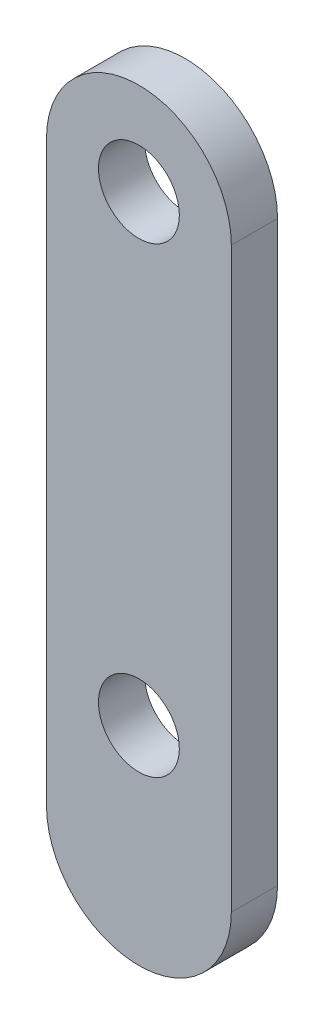
ISO-10303-21;
HEADER;
FILE_DESCRIPTION(('STEP AP214'),'2;1');
FILE_NAME('part.step','',(''),(''),'','','');
FILE_SCHEMA(('AUTOMOTIVE_DESIGN { 1 0 10303 214 1 1 1 1 }'));
ENDSEC;
DATA;
#1=APPLICATION_CONTEXT('core data for automotive mechanical design processes');
#2=APPLICATION_PROTOCOL_DEFINITION('international standard','automotive_design',2000,#1);
#3=PRODUCT_CONTEXT('',#1,'mechanical');
#4=PRODUCT('Part','Part','',(#3));
#5=PRODUCT_RELATED_PRODUCT_CATEGORY('part','',(#4));
#6=PRODUCT_DEFINITION_FORMATION('','',#4);
#7=PRODUCT_DEFINITION_CONTEXT('part definition',#1,'design');
#8=PRODUCT_DEFINITION('design','',#6,#7);
#9=PRODUCT_DEFINITION_SHAPE('','',#8);
#10=(LENGTH_UNIT() NAMED_UNIT(*) SI_UNIT(.MILLI.,.METRE.));
#11=(NAMED_UNIT(*) PLANE_ANGLE_UNIT() SI_UNIT($,.RADIAN.));
#12=(NAMED_UNIT(*) SI_UNIT($,.STERADIAN.) SOLID_ANGLE_UNIT());
#13=UNCERTAINTY_MEASURE_WITH_UNIT(LENGTH_MEASURE(1.E-05),#10,'distance_accuracy_value','');
#14=(GEOMETRIC_REPRESENTATION_CONTEXT(3) GLOBAL_UNCERTAINTY_ASSIGNED_CONTEXT((#13)) GLOBAL_UNIT_ASSIGNED_CONTEXT((#10,
#11,#12)) REPRESENTATION_CONTEXT('',''));
#15=CARTESIAN_POINT('',(0.,0.,0.));
#16=DIRECTION('',(0.,0.,1.));
#17=DIRECTION('',(1.,0.,0.));
#18=AXIS2_PLACEMENT_3D('',#15,#16,#17);
#19=CARTESIAN_POINT('',(0.,0.,2.));
#20=DIRECTION('',(0.,0.,1.));
#21=DIRECTION('',(1.,0.,0.));
#22=AXIS2_PLACEMENT_3D('',#19,#20,#21);
#23=PLANE('',#22);
#24=CARTESIAN_POINT('',(0.,5.,2.));
#25=DIRECTION('',(0.,0.,1.));
#26=DIRECTION('',(1.,0.,0.));
#27=AXIS2_PLACEMENT_3D('',#24,#25,#26);
#28=CIRCLE('',#27,1.75);
#29=CARTESIAN_POINT('',(1.75,5.,2.));
#30=VERTEX_POINT('',#29);
#31=EDGE_CURVE('E106',#30,#30,#28,.T.);
#32=ORIENTED_EDGE('',*,*,#31,.F.);
#33=EDGE_LOOP('',(#32));
#34=FACE_BOUND('',#33,.T.);
#35=CARTESIAN_POINT('',(0.,0.,2.));
#36=DIRECTION('',(0.,0.,1.));
#37=DIRECTION('',(1.,0.,0.));
#38=AXIS2_PLACEMENT_3D('',#35,#36,#37);
#39=CIRCLE('',#38,4.);
#40=CARTESIAN_POINT('',(-4.,0.,2.));
#41=VERTEX_POINT('',#40);
#42=CARTESIAN_POINT('',(4.,0.,2.));
#43=VERTEX_POINT('',#42);
#44=EDGE_CURVE('E91',#41,#43,#39,.T.);
#45=ORIENTED_EDGE('',*,*,#44,.T.);
#46=DIRECTION('',(0.,1.,0.));
#47=VECTOR('',#46,1.);
#48=CARTESIAN_POINT('',(4.,0.,2.));
#49=LINE('',#48,#47);
#50=CARTESIAN_POINT('',(4.,25.,2.));
#51=VERTEX_POINT('',#50);
#52=EDGE_CURVE('E86',#43,#51,#49,.T.);
#53=ORIENTED_EDGE('',*,*,#52,.T.);
#54=CARTESIAN_POINT('',(0.,25.,2.));
#55=DIRECTION('',(0.,0.,1.));
#56=DIRECTION('',(1.,0.,0.));
#57=AXIS2_PLACEMENT_3D('',#54,#55,#56);
#58=CIRCLE('',#57,4.);
#59=CARTESIAN_POINT('',(-4.,25.,2.));
#60=VERTEX_POINT('',#59);
#61=EDGE_CURVE('E89',#51,#60,#58,.T.);
#62=ORIENTED_EDGE('',*,*,#61,.T.);
#63=DIRECTION('',(0.,-1.,0.));
#64=VECTOR('',#63,1.);
#65=CARTESIAN_POINT('',(-4.,0.,2.));
#66=LINE('',#65,#64);
#67=EDGE_CURVE('E56',#60,#41,#66,.T.);
#68=ORIENTED_EDGE('',*,*,#67,.T.);
#69=EDGE_LOOP('',(#45,#53,#62,#68));
#70=FACE_BOUND('',#69,.T.);
#71=CARTESIAN_POINT('',(0.,25.,2.));
#72=DIRECTION('',(0.,0.,1.));
#73=DIRECTION('',(1.,0.,0.));
#74=AXIS2_PLACEMENT_3D('',#71,#72,#73);
#75=CIRCLE('',#74,1.75);
#76=CARTESIAN_POINT('',(1.75,25.,2.));
#77=VERTEX_POINT('',#76);
#78=EDGE_CURVE('E121',#77,#77,#75,.T.);
#79=ORIENTED_EDGE('',*,*,#78,.F.);
#80=EDGE_LOOP('',(#79));
#81=FACE_BOUND('',#80,.T.);
#82=ADVANCED_FACE('F39',(#34,#70,#81),#23,.T.);
#83=CARTESIAN_POINT('',(0.,0.,0.));
#84=DIRECTION('',(0.,0.,1.));
#85=DIRECTION('',(1.,0.,0.));
#86=AXIS2_PLACEMENT_3D('',#83,#84,#85);
#87=PLANE('',#86);
#88=CARTESIAN_POINT('',(0.,0.,0.));
#89=DIRECTION('',(0.,0.,1.));
#90=DIRECTION('',(1.,0.,0.));
#91=AXIS2_PLACEMENT_3D('',#88,#89,#90);
#92=CIRCLE('',#91,4.);
#93=CARTESIAN_POINT('',(-4.,0.,0.));
#94=VERTEX_POINT('',#93);
#95=CARTESIAN_POINT('',(4.,0.,0.));
#96=VERTEX_POINT('',#95);
#97=EDGE_CURVE('E103',#94,#96,#92,.T.);
#98=ORIENTED_EDGE('',*,*,#97,.F.);
#99=DIRECTION('',(0.,-1.,0.));
#100=VECTOR('',#99,1.);
#101=CARTESIAN_POINT('',(-4.,0.,0.));
#102=LINE('',#101,#100);
#103=CARTESIAN_POINT('',(-4.,25.,0.));
#104=VERTEX_POINT('',#103);
#105=EDGE_CURVE('E79',#104,#94,#102,.T.);
#106=ORIENTED_EDGE('',*,*,#105,.F.);
#107=CARTESIAN_POINT('',(0.,25.,0.));
#108=DIRECTION('',(0.,0.,1.));
#109=DIRECTION('',(1.,0.,0.));
#110=AXIS2_PLACEMENT_3D('',#107,#108,#109);
#111=CIRCLE('',#110,4.);
#112=CARTESIAN_POINT('',(4.,25.,0.));
#113=VERTEX_POINT('',#112);
#114=EDGE_CURVE('E73',#113,#104,#111,.T.);
#115=ORIENTED_EDGE('',*,*,#114,.F.);
#116=DIRECTION('',(0.,1.,0.));
#117=VECTOR('',#116,1.);
#118=CARTESIAN_POINT('',(4.,0.,0.));
#119=LINE('',#118,#117);
#120=EDGE_CURVE('E95',#96,#113,#119,.T.);
#121=ORIENTED_EDGE('',*,*,#120,.F.);
#122=EDGE_LOOP('',(#98,#106,#115,#121));
#123=FACE_BOUND('',#122,.T.);
#124=CARTESIAN_POINT('',(0.,5.,0.));
#125=DIRECTION('',(0.,0.,1.));
#126=DIRECTION('',(1.,0.,0.));
#127=AXIS2_PLACEMENT_3D('',#124,#125,#126);
#128=CIRCLE('',#127,1.75);
#129=CARTESIAN_POINT('',(1.75,5.,0.));
#130=VERTEX_POINT('',#129);
#131=EDGE_CURVE('E118',#130,#130,#128,.T.);
#132=ORIENTED_EDGE('',*,*,#131,.T.);
#133=EDGE_LOOP('',(#132));
#134=FACE_BOUND('',#133,.T.);
#135=CARTESIAN_POINT('',(0.,25.,0.));
#136=DIRECTION('',(0.,0.,1.));
#137=DIRECTION('',(1.,0.,0.));
#138=AXIS2_PLACEMENT_3D('',#135,#136,#137);
#139=CIRCLE('',#138,1.75);
#140=CARTESIAN_POINT('',(1.75,25.,0.));
#141=VERTEX_POINT('',#140);
#142=EDGE_CURVE('E124',#141,#141,#139,.T.);
#143=ORIENTED_EDGE('',*,*,#142,.T.);
#144=EDGE_LOOP('',(#143));
#145=FACE_BOUND('',#144,.T.);
#146=ADVANCED_FACE('F114',(#123,#134,#145),#87,.F.);
#147=CARTESIAN_POINT('',(0.,0.,2.));
#148=DIRECTION('',(0.,0.,-1.));
#149=DIRECTION('',(-1.,0.,0.));
#150=AXIS2_PLACEMENT_3D('',#147,#148,#149);
#151=CYLINDRICAL_SURFACE('',#150,4.);
#152=ORIENTED_EDGE('',*,*,#97,.T.);
#153=DIRECTION('',(0.,0.,-1.));
#154=VECTOR('',#153,1.);
#155=CARTESIAN_POINT('',(4.,0.,2.));
#156=LINE('',#155,#154);
#157=EDGE_CURVE('E11',#43,#96,#156,.T.);
#158=ORIENTED_EDGE('',*,*,#157,.F.);
#159=ORIENTED_EDGE('',*,*,#44,.F.);
#160=DIRECTION('',(0.,0.,-1.));
#161=VECTOR('',#160,1.);
#162=CARTESIAN_POINT('',(-4.,0.,2.));
#163=LINE('',#162,#161);
#164=EDGE_CURVE('E99',#41,#94,#163,.T.);
#165=ORIENTED_EDGE('',*,*,#164,.T.);
#166=EDGE_LOOP('',(#152,#158,#159,#165));
#167=FACE_BOUND('',#166,.T.);
#168=ADVANCED_FACE('F41',(#167),#151,.T.);
#169=CARTESIAN_POINT('',(4.,0.,2.));
#170=DIRECTION('',(-1.,0.,0.));
#171=DIRECTION('',(0.,0.,1.));
#172=AXIS2_PLACEMENT_3D('',#169,#170,#171);
#173=PLANE('',#172);
#174=ORIENTED_EDGE('',*,*,#120,.T.);
#175=DIRECTION('',(0.,0.,-1.));
#176=VECTOR('',#175,1.);
#177=CARTESIAN_POINT('',(4.,25.,2.));
#178=LINE('',#177,#176);
#179=EDGE_CURVE('E48',#51,#113,#178,.T.);
#180=ORIENTED_EDGE('',*,*,#179,.F.);
#181=ORIENTED_EDGE('',*,*,#52,.F.);
#182=ORIENTED_EDGE('',*,*,#157,.T.);
#183=EDGE_LOOP('',(#174,#180,#181,#182));
#184=FACE_BOUND('',#183,.T.);
#185=ADVANCED_FACE('F94',(#184),#173,.F.);
#186=CARTESIAN_POINT('',(0.,25.,2.));
#187=DIRECTION('',(0.,0.,-1.));
#188=DIRECTION('',(-1.,0.,0.));
#189=AXIS2_PLACEMENT_3D('',#186,#187,#188);
#190=CYLINDRICAL_SURFACE('',#189,4.);
#191=ORIENTED_EDGE('',*,*,#114,.T.);
#192=DIRECTION('',(0.,0.,-1.));
#193=VECTOR('',#192,1.);
#194=CARTESIAN_POINT('',(-4.,25.,2.));
#195=LINE('',#194,#193);
#196=EDGE_CURVE('E96',#60,#104,#195,.T.);
#197=ORIENTED_EDGE('',*,*,#196,.F.);
#198=ORIENTED_EDGE('',*,*,#61,.F.);
#199=ORIENTED_EDGE('',*,*,#179,.T.);
#200=EDGE_LOOP('',(#191,#197,#198,#199));
#201=FACE_BOUND('',#200,.T.);
#202=ADVANCED_FACE('F97',(#201),#190,.T.);
#203=CARTESIAN_POINT('',(-4.,0.,2.));
#204=DIRECTION('',(1.,0.,0.));
#205=DIRECTION('',(0.,0.,-1.));
#206=AXIS2_PLACEMENT_3D('',#203,#204,#205);
#207=PLANE('',#206);
#208=ORIENTED_EDGE('',*,*,#105,.T.);
#209=ORIENTED_EDGE('',*,*,#164,.F.);
#210=ORIENTED_EDGE('',*,*,#67,.F.);
#211=ORIENTED_EDGE('',*,*,#196,.T.);
#212=EDGE_LOOP('',(#208,#209,#210,#211));
#213=FACE_BOUND('',#212,.T.);
#214=ADVANCED_FACE('F111',(#213),#207,.F.);
#215=CARTESIAN_POINT('',(0.,5.,2.));
#216=DIRECTION('',(0.,0.,-1.));
#217=DIRECTION('',(-1.,0.,0.));
#218=AXIS2_PLACEMENT_3D('',#215,#216,#217);
#219=CYLINDRICAL_SURFACE('',#218,1.75);
#220=ORIENTED_EDGE('',*,*,#31,.T.);
#221=EDGE_LOOP('',(#220));
#222=FACE_BOUND('',#221,.T.);
#223=ORIENTED_EDGE('',*,*,#131,.F.);
#224=EDGE_LOOP('',(#223));
#225=FACE_BOUND('',#224,.T.);
#226=ADVANCED_FACE('F141',(#222,#225),#219,.F.);
#227=CARTESIAN_POINT('',(0.,25.,2.));
#228=DIRECTION('',(0.,0.,-1.));
#229=DIRECTION('',(-1.,0.,0.));
#230=AXIS2_PLACEMENT_3D('',#227,#228,#229);
#231=CYLINDRICAL_SURFACE('',#230,1.75);
#232=ORIENTED_EDGE('',*,*,#78,.T.);
#233=EDGE_LOOP('',(#232));
#234=FACE_BOUND('',#233,.T.);
#235=ORIENTED_EDGE('',*,*,#142,.F.);
#236=EDGE_LOOP('',(#235));
#237=FACE_BOUND('',#236,.T.);
#238=ADVANCED_FACE('F130',(#234,#237),#231,.F.);
#239=CLOSED_SHELL('',(#82,#146,#168,#185,#202,#214,#226,#238));
#240=MANIFOLD_SOLID_BREP('B2',#239);
#241=ADVANCED_BREP_SHAPE_REPRESENTATION('',(#18,#240),#14);
#242=SHAPE_DEFINITION_REPRESENTATION(#9,#241);
ENDSEC;
END-ISO-10303-21;
